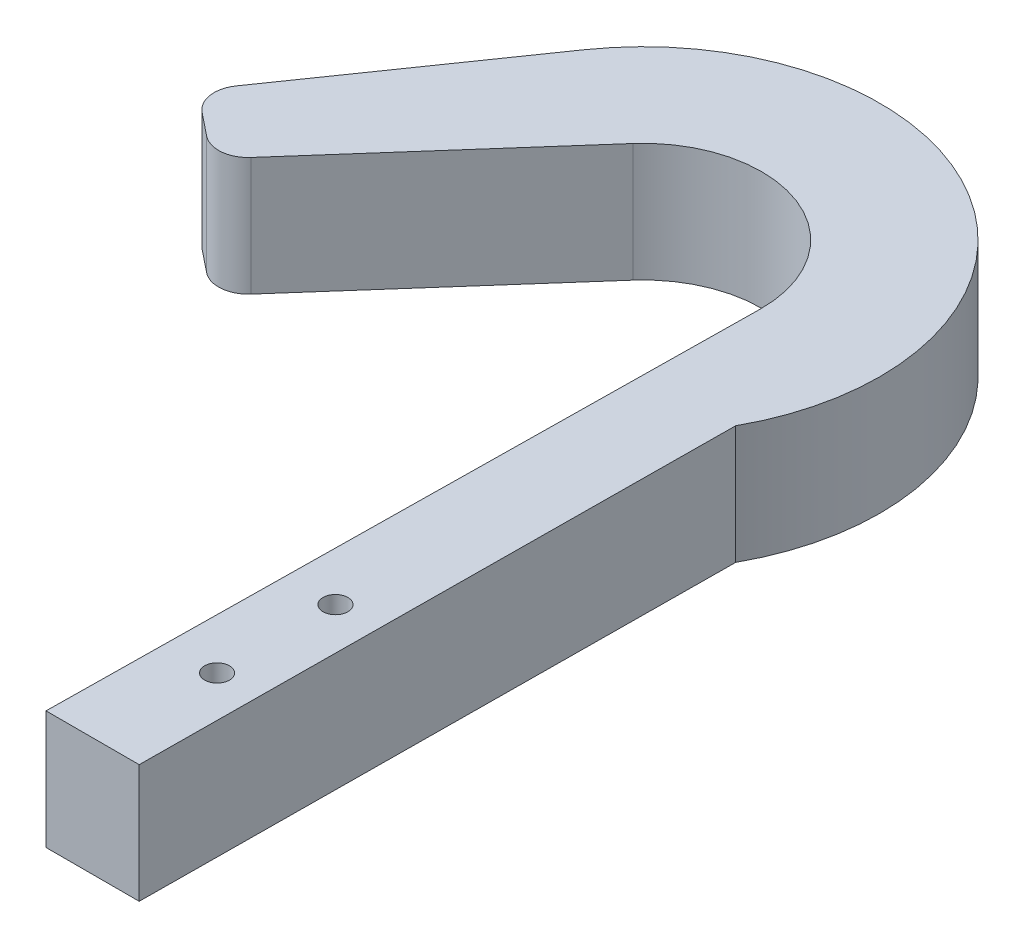
ISO-10303-21;
HEADER;
FILE_DESCRIPTION(('STEP AP214'),'2;1');
FILE_NAME('part.step','',(''),(''),'','','');
FILE_SCHEMA(('AUTOMOTIVE_DESIGN { 1 0 10303 214 1 1 1 1 }'));
ENDSEC;
DATA;
#1=APPLICATION_CONTEXT('core data for automotive mechanical design processes');
#2=APPLICATION_PROTOCOL_DEFINITION('international standard','automotive_design',2000,#1);
#3=PRODUCT_CONTEXT('',#1,'mechanical');
#4=PRODUCT('Part','Part','',(#3));
#5=PRODUCT_RELATED_PRODUCT_CATEGORY('part','',(#4));
#6=PRODUCT_DEFINITION_FORMATION('','',#4);
#7=PRODUCT_DEFINITION_CONTEXT('part definition',#1,'design');
#8=PRODUCT_DEFINITION('design','',#6,#7);
#9=PRODUCT_DEFINITION_SHAPE('','',#8);
#10=(LENGTH_UNIT() NAMED_UNIT(*) SI_UNIT(.MILLI.,.METRE.));
#11=(NAMED_UNIT(*) PLANE_ANGLE_UNIT() SI_UNIT($,.RADIAN.));
#12=(NAMED_UNIT(*) SI_UNIT($,.STERADIAN.) SOLID_ANGLE_UNIT());
#13=UNCERTAINTY_MEASURE_WITH_UNIT(LENGTH_MEASURE(1.E-05),#10,'distance_accuracy_value','');
#14=(GEOMETRIC_REPRESENTATION_CONTEXT(3) GLOBAL_UNCERTAINTY_ASSIGNED_CONTEXT((#13)) GLOBAL_UNIT_ASSIGNED_CONTEXT((#10,
#11,#12)) REPRESENTATION_CONTEXT('',''));
#15=CARTESIAN_POINT('',(0.,0.,0.));
#16=DIRECTION('',(0.,0.,1.));
#17=DIRECTION('',(1.,0.,0.));
#18=AXIS2_PLACEMENT_3D('',#15,#16,#17);
#19=CARTESIAN_POINT('',(-159.444359511071,25.4,-83.1976796572985));
#20=DIRECTION('',(0.,-1.,0.));
#21=DIRECTION('',(0.,0.,-1.));
#22=AXIS2_PLACEMENT_3D('',#19,#20,#21);
#23=CYLINDRICAL_SURFACE('',#22,6.35000000000001);
#24=CARTESIAN_POINT('',(-159.444359511071,0.,-83.1976796572985));
#25=DIRECTION('',(0.,1.,0.));
#26=DIRECTION('',(0.,0.,-1.));
#27=AXIS2_PLACEMENT_3D('',#24,#25,#26);
#28=CIRCLE('',#27,6.35000000000001);
#29=CARTESIAN_POINT('',(-163.411771611835,0.,-78.2396416156222));
#30=VERTEX_POINT('',#29);
#31=CARTESIAN_POINT('',(-154.679488647872,0.,-79.0002392876154));
#32=VERTEX_POINT('',#31);
#33=EDGE_CURVE('E153',#30,#32,#28,.T.);
#34=ORIENTED_EDGE('',*,*,#33,.T.);
#35=DIRECTION('',(0.,-1.,0.));
#36=VECTOR('',#35,1.);
#37=CARTESIAN_POINT('',(-154.679488647872,25.4,-79.0002392876154));
#38=LINE('',#37,#36);
#39=CARTESIAN_POINT('',(-154.679488647872,25.4,-79.0002392876154));
#40=VERTEX_POINT('',#39);
#41=EDGE_CURVE('E13',#40,#32,#38,.T.);
#42=ORIENTED_EDGE('',*,*,#41,.F.);
#43=CARTESIAN_POINT('',(-159.444359511071,25.4,-83.1976796572985));
#44=DIRECTION('',(0.,1.,0.));
#45=DIRECTION('',(0.,0.,-1.));
#46=AXIS2_PLACEMENT_3D('',#43,#44,#45);
#47=CIRCLE('',#46,6.35000000000001);
#48=CARTESIAN_POINT('',(-163.411771611835,25.4,-78.2396416156222));
#49=VERTEX_POINT('',#48);
#50=EDGE_CURVE('E172',#49,#40,#47,.T.);
#51=ORIENTED_EDGE('',*,*,#50,.F.);
#52=DIRECTION('',(0.,-1.,0.));
#53=VECTOR('',#52,1.);
#54=CARTESIAN_POINT('',(-163.411771611835,25.4,-78.2396416156222));
#55=LINE('',#54,#53);
#56=EDGE_CURVE('E149',#49,#30,#55,.T.);
#57=ORIENTED_EDGE('',*,*,#56,.T.);
#58=EDGE_LOOP('',(#34,#42,#51,#57));
#59=FACE_BOUND('',#58,.T.);
#60=ADVANCED_FACE('F45',(#59),#23,.T.);
#61=CARTESIAN_POINT('',(-116.297746729286,25.4,-122.57061257215));
#62=DIRECTION('',(-0.750373364283177,0.,-0.661014231446152));
#63=DIRECTION('',(-0.661014231446152,0.,0.750373364283177));
#64=AXIS2_PLACEMENT_3D('',#61,#62,#63);
#65=PLANE('',#64);
#66=DIRECTION('',(0.661014231446152,0.,-0.750373364283177));
#67=VECTOR('',#66,1.);
#68=CARTESIAN_POINT('',(-116.297746729286,0.,-122.57061257215));
#69=LINE('',#68,#67);
#70=CARTESIAN_POINT('',(-116.297746729286,0.,-122.57061257215));
#71=VERTEX_POINT('',#70);
#72=EDGE_CURVE('E156',#32,#71,#69,.T.);
#73=ORIENTED_EDGE('',*,*,#72,.T.);
#74=DIRECTION('',(0.,-1.,0.));
#75=VECTOR('',#74,1.);
#76=CARTESIAN_POINT('',(-116.297746729286,25.4,-122.57061257215));
#77=LINE('',#76,#75);
#78=CARTESIAN_POINT('',(-116.297746729286,25.4,-122.57061257215));
#79=VERTEX_POINT('',#78);
#80=EDGE_CURVE('E53',#79,#71,#77,.T.);
#81=ORIENTED_EDGE('',*,*,#80,.F.);
#82=DIRECTION('',(0.661014231446152,0.,-0.750373364283177));
#83=VECTOR('',#82,1.);
#84=CARTESIAN_POINT('',(-116.297746729286,25.4,-122.57061257215));
#85=LINE('',#84,#83);
#86=EDGE_CURVE('E110',#40,#79,#85,.T.);
#87=ORIENTED_EDGE('',*,*,#86,.F.);
#88=ORIENTED_EDGE('',*,*,#41,.T.);
#89=EDGE_LOOP('',(#73,#81,#87,#88));
#90=FACE_BOUND('',#89,.T.);
#91=ADVANCED_FACE('F253',(#90),#65,.F.);
#92=CARTESIAN_POINT('',(-97.2382632764932,25.4,-105.780851093417));
#93=DIRECTION('',(0.,-1.,0.));
#94=DIRECTION('',(0.,0.,-1.));
#95=AXIS2_PLACEMENT_3D('',#92,#93,#94);
#96=CYLINDRICAL_SURFACE('',#95,25.4);
#97=CARTESIAN_POINT('',(-97.2382632764932,0.,-105.780851093417));
#98=DIRECTION('',(0.,-1.,0.));
#99=DIRECTION('',(0.,0.,1.));
#100=AXIS2_PLACEMENT_3D('',#97,#98,#99);
#101=CIRCLE('',#100,25.4);
#102=CARTESIAN_POINT('',(-71.8404305336808,0.,-105.449049996177));
#103=VERTEX_POINT('',#102);
#104=EDGE_CURVE('E159',#71,#103,#101,.T.);
#105=ORIENTED_EDGE('',*,*,#104,.T.);
#106=DIRECTION('',(0.,-1.,0.));
#107=VECTOR('',#106,1.);
#108=CARTESIAN_POINT('',(-71.8404305336808,25.4,-105.449049996177));
#109=LINE('',#108,#107);
#110=CARTESIAN_POINT('',(-71.8404305336808,25.4,-105.449049996177));
#111=VERTEX_POINT('',#110);
#112=EDGE_CURVE('E185',#111,#103,#109,.T.);
#113=ORIENTED_EDGE('',*,*,#112,.F.);
#114=CARTESIAN_POINT('',(-97.2382632764932,25.4,-105.780851093417));
#115=DIRECTION('',(0.,-1.,0.));
#116=DIRECTION('',(0.,0.,1.));
#117=AXIS2_PLACEMENT_3D('',#114,#115,#116);
#118=CIRCLE('',#117,25.4);
#119=EDGE_CURVE('E193',#79,#111,#118,.T.);
#120=ORIENTED_EDGE('',*,*,#119,.F.);
#121=ORIENTED_EDGE('',*,*,#80,.T.);
#122=EDGE_LOOP('',(#105,#113,#120,#121));
#123=FACE_BOUND('',#122,.T.);
#124=ADVANCED_FACE('F191',(#123),#96,.F.);
#125=CARTESIAN_POINT('',(-71.8404305336808,25.4,-105.449049996177));
#126=DIRECTION('',(0.999914674913871,0.,0.0130630353244421));
#127=DIRECTION('',(0.0130630353244421,0.,-0.999914674913871));
#128=AXIS2_PLACEMENT_3D('',#125,#126,#127);
#129=PLANE('',#128);
#130=DIRECTION('',(-0.0130630353244421,0.,0.999914674913871));
#131=VECTOR('',#130,1.);
#132=CARTESIAN_POINT('',(-71.8404305336808,0.,-105.449049996177));
#133=LINE('',#132,#131);
#134=CARTESIAN_POINT('',(-73.8167409904888,0.,45.8283353026622));
#135=VERTEX_POINT('',#134);
#136=EDGE_CURVE('E161',#103,#135,#133,.T.);
#137=ORIENTED_EDGE('',*,*,#136,.T.);
#138=DIRECTION('',(0.,-1.,0.));
#139=VECTOR('',#138,1.);
#140=CARTESIAN_POINT('',(-73.8167409904888,25.4,45.8283353026622));
#141=LINE('',#140,#139);
#142=CARTESIAN_POINT('',(-73.8167409904888,25.4,45.8283353026622));
#143=VERTEX_POINT('',#142);
#144=EDGE_CURVE('E182',#143,#135,#141,.T.);
#145=ORIENTED_EDGE('',*,*,#144,.F.);
#146=DIRECTION('',(-0.0130630353244421,0.,0.999914674913871));
#147=VECTOR('',#146,1.);
#148=CARTESIAN_POINT('',(-71.8404305336808,25.4,-105.449049996177));
#149=LINE('',#148,#147);
#150=EDGE_CURVE('E211',#111,#143,#149,.T.);
#151=ORIENTED_EDGE('',*,*,#150,.F.);
#152=ORIENTED_EDGE('',*,*,#112,.T.);
#153=EDGE_LOOP('',(#137,#145,#151,#152));
#154=FACE_BOUND('',#153,.T.);
#155=ADVANCED_FACE('F202',(#154),#129,.F.);
#156=CARTESIAN_POINT('',(-73.8167409904888,25.4,45.8283353026622));
#157=DIRECTION('',(0.,0.,-1.));
#158=DIRECTION('',(-1.,0.,0.));
#159=AXIS2_PLACEMENT_3D('',#156,#157,#158);
#160=PLANE('',#159);
#161=DIRECTION('',(1.,0.,0.));
#162=VECTOR('',#161,1.);
#163=CARTESIAN_POINT('',(-73.8167409904888,0.,45.8283353026622));
#164=LINE('',#163,#162);
#165=CARTESIAN_POINT('',(-53.8167409904887,0.,45.8283353026622));
#166=VERTEX_POINT('',#165);
#167=EDGE_CURVE('E163',#135,#166,#164,.T.);
#168=ORIENTED_EDGE('',*,*,#167,.T.);
#169=DIRECTION('',(0.,-1.,0.));
#170=VECTOR('',#169,1.);
#171=CARTESIAN_POINT('',(-53.8167409904887,25.4,45.8283353026622));
#172=LINE('',#171,#170);
#173=CARTESIAN_POINT('',(-53.8167409904887,25.4,45.8283353026622));
#174=VERTEX_POINT('',#173);
#175=EDGE_CURVE('E179',#174,#166,#172,.T.);
#176=ORIENTED_EDGE('',*,*,#175,.F.);
#177=DIRECTION('',(1.,0.,0.));
#178=VECTOR('',#177,1.);
#179=CARTESIAN_POINT('',(-73.8167409904888,25.4,45.8283353026622));
#180=LINE('',#179,#178);
#181=EDGE_CURVE('E208',#143,#174,#180,.T.);
#182=ORIENTED_EDGE('',*,*,#181,.F.);
#183=ORIENTED_EDGE('',*,*,#144,.T.);
#184=EDGE_LOOP('',(#168,#176,#182,#183));
#185=FACE_BOUND('',#184,.T.);
#186=ADVANCED_FACE('F206',(#185),#160,.F.);
#187=CARTESIAN_POINT('',(-53.8167409904887,25.4,45.8283353026622));
#188=DIRECTION('',(-0.999967764004321,0.,-0.00802938056137474));
#189=DIRECTION('',(-0.00802938056137474,0.,0.999967764004321));
#190=AXIS2_PLACEMENT_3D('',#187,#188,#189);
#191=PLANE('',#190);
#192=DIRECTION('',(0.00802938056137474,0.,-0.999967764004321));
#193=VECTOR('',#192,1.);
#194=CARTESIAN_POINT('',(-53.8167409904887,0.,45.8283353026622));
#195=LINE('',#194,#193);
#196=CARTESIAN_POINT('',(-52.7969767860797,0.,-81.1716646973378));
#197=VERTEX_POINT('',#196);
#198=EDGE_CURVE('E165',#166,#197,#195,.T.);
#199=ORIENTED_EDGE('',*,*,#198,.T.);
#200=DIRECTION('',(0.,-1.,0.));
#201=VECTOR('',#200,1.);
#202=CARTESIAN_POINT('',(-52.7969767860797,25.4,-81.1716646973378));
#203=LINE('',#202,#201);
#204=CARTESIAN_POINT('',(-52.7969767860797,25.4,-81.1716646973378));
#205=VERTEX_POINT('',#204);
#206=EDGE_CURVE('E176',#205,#197,#203,.T.);
#207=ORIENTED_EDGE('',*,*,#206,.F.);
#208=DIRECTION('',(0.00802938056137474,0.,-0.999967764004321));
#209=VECTOR('',#208,1.);
#210=CARTESIAN_POINT('',(-53.8167409904887,25.4,45.8283353026622));
#211=LINE('',#210,#209);
#212=EDGE_CURVE('E210',#174,#205,#211,.T.);
#213=ORIENTED_EDGE('',*,*,#212,.F.);
#214=ORIENTED_EDGE('',*,*,#175,.T.);
#215=EDGE_LOOP('',(#199,#207,#213,#214));
#216=FACE_BOUND('',#215,.T.);
#217=ADVANCED_FACE('F265',(#216),#191,.F.);
#218=CARTESIAN_POINT('',(-97.2382632764932,25.4,-105.780851093417));
#219=DIRECTION('',(0.,-1.,0.));
#220=DIRECTION('',(0.,0.,-1.));
#221=AXIS2_PLACEMENT_3D('',#218,#219,#220);
#222=CYLINDRICAL_SURFACE('',#221,50.8);
#223=CARTESIAN_POINT('',(-97.2382632764932,0.,-105.780851093417));
#224=DIRECTION('',(0.,1.,0.));
#225=DIRECTION('',(0.,0.,1.));
#226=AXIS2_PLACEMENT_3D('',#223,#224,#225);
#227=CIRCLE('',#226,50.8);
#228=CARTESIAN_POINT('',(-138.959581608563,0.,-134.763114577039));
#229=VERTEX_POINT('',#228);
#230=EDGE_CURVE('E167',#197,#229,#227,.T.);
#231=ORIENTED_EDGE('',*,*,#230,.T.);
#232=DIRECTION('',(0.,-1.,0.));
#233=VECTOR('',#232,1.);
#234=CARTESIAN_POINT('',(-138.959581608563,25.4,-134.763114577039));
#235=LINE('',#234,#233);
#236=CARTESIAN_POINT('',(-138.959581608563,25.4,-134.763114577039));
#237=VERTEX_POINT('',#236);
#238=EDGE_CURVE('E144',#237,#229,#235,.T.);
#239=ORIENTED_EDGE('',*,*,#238,.F.);
#240=CARTESIAN_POINT('',(-97.2382632764932,25.4,-105.780851093417));
#241=DIRECTION('',(0.,1.,0.));
#242=DIRECTION('',(0.,0.,1.));
#243=AXIS2_PLACEMENT_3D('',#240,#241,#242);
#244=CIRCLE('',#243,50.8);
#245=EDGE_CURVE('E135',#205,#237,#244,.T.);
#246=ORIENTED_EDGE('',*,*,#245,.F.);
#247=ORIENTED_EDGE('',*,*,#206,.T.);
#248=EDGE_LOOP('',(#231,#239,#246,#247));
#249=FACE_BOUND('',#248,.T.);
#250=ADVANCED_FACE('F262',(#249),#222,.T.);
#251=CARTESIAN_POINT('',(-138.959581608563,25.4,-134.763114577039));
#252=DIRECTION('',(0.821285793938387,0.,0.57051699770909));
#253=DIRECTION('',(0.57051699770909,0.,-0.821285793938387));
#254=AXIS2_PLACEMENT_3D('',#251,#252,#253);
#255=PLANE('',#254);
#256=DIRECTION('',(-0.57051699770909,0.,0.821285793938387));
#257=VECTOR('',#256,1.);
#258=CARTESIAN_POINT('',(-138.959581608563,0.,-134.763114577039));
#259=LINE('',#258,#257);
#260=CARTESIAN_POINT('',(-169.546861652518,0.,-90.7313001417323));
#261=VERTEX_POINT('',#260);
#262=EDGE_CURVE('E143',#229,#261,#259,.T.);
#263=ORIENTED_EDGE('',*,*,#262,.T.);
#264=DIRECTION('',(0.,-1.,0.));
#265=VECTOR('',#264,1.);
#266=CARTESIAN_POINT('',(-169.546861652518,25.4,-90.7313001417323));
#267=LINE('',#266,#265);
#268=CARTESIAN_POINT('',(-169.546861652518,25.4,-90.7313001417323));
#269=VERTEX_POINT('',#268);
#270=EDGE_CURVE('E140',#269,#261,#267,.T.);
#271=ORIENTED_EDGE('',*,*,#270,.F.);
#272=DIRECTION('',(-0.57051699770909,0.,0.821285793938387));
#273=VECTOR('',#272,1.);
#274=CARTESIAN_POINT('',(-138.959581608563,25.4,-134.763114577039));
#275=LINE('',#274,#273);
#276=EDGE_CURVE('E129',#237,#269,#275,.T.);
#277=ORIENTED_EDGE('',*,*,#276,.F.);
#278=ORIENTED_EDGE('',*,*,#238,.T.);
#279=EDGE_LOOP('',(#263,#271,#277,#278));
#280=FACE_BOUND('',#279,.T.);
#281=ADVANCED_FACE('F141',(#280),#255,.F.);
#282=CARTESIAN_POINT('',(-164.331696861009,25.4,-87.1085172062795));
#283=DIRECTION('',(0.,-1.,0.));
#284=DIRECTION('',(0.,0.,-1.));
#285=AXIS2_PLACEMENT_3D('',#282,#283,#284);
#286=CYLINDRICAL_SURFACE('',#285,6.34999999999999);
#287=CARTESIAN_POINT('',(-164.331696861009,0.,-87.1085172062795));
#288=DIRECTION('',(0.,1.,0.));
#289=DIRECTION('',(0.,0.,1.));
#290=AXIS2_PLACEMENT_3D('',#287,#288,#289);
#291=CIRCLE('',#290,6.34999999999999);
#292=CARTESIAN_POINT('',(-168.299108961773,0.,-82.1504791646033));
#293=VERTEX_POINT('',#292);
#294=EDGE_CURVE('E96',#261,#293,#291,.T.);
#295=ORIENTED_EDGE('',*,*,#294,.T.);
#296=DIRECTION('',(0.,-1.,0.));
#297=VECTOR('',#296,1.);
#298=CARTESIAN_POINT('',(-168.299108961773,25.4,-82.1504791646033));
#299=LINE('',#298,#297);
#300=CARTESIAN_POINT('',(-168.299108961773,25.4,-82.1504791646033));
#301=VERTEX_POINT('',#300);
#302=EDGE_CURVE('E145',#301,#293,#299,.T.);
#303=ORIENTED_EDGE('',*,*,#302,.F.);
#304=CARTESIAN_POINT('',(-164.331696861009,25.4,-87.1085172062795));
#305=DIRECTION('',(0.,1.,0.));
#306=DIRECTION('',(0.,0.,1.));
#307=AXIS2_PLACEMENT_3D('',#304,#305,#306);
#308=CIRCLE('',#307,6.34999999999999);
#309=EDGE_CURVE('E133',#269,#301,#308,.T.);
#310=ORIENTED_EDGE('',*,*,#309,.F.);
#311=ORIENTED_EDGE('',*,*,#270,.T.);
#312=EDGE_LOOP('',(#295,#303,#310,#311));
#313=FACE_BOUND('',#312,.T.);
#314=ADVANCED_FACE('F147',(#313),#286,.T.);
#315=CARTESIAN_POINT('',(-168.299108961773,25.4,-82.1504791646033));
#316=DIRECTION('',(0.624789307206975,0.,-0.780793392389964));
#317=DIRECTION('',(-0.780793392389964,0.,-0.624789307206975));
#318=AXIS2_PLACEMENT_3D('',#315,#316,#317);
#319=PLANE('',#318);
#320=DIRECTION('',(0.780793392389964,0.,0.624789307206975));
#321=VECTOR('',#320,1.);
#322=CARTESIAN_POINT('',(-168.299108961773,0.,-82.1504791646033));
#323=LINE('',#322,#321);
#324=EDGE_CURVE('E102',#293,#30,#323,.T.);
#325=ORIENTED_EDGE('',*,*,#324,.T.);
#326=ORIENTED_EDGE('',*,*,#56,.F.);
#327=DIRECTION('',(0.780793392389964,0.,0.624789307206975));
#328=VECTOR('',#327,1.);
#329=CARTESIAN_POINT('',(-168.299108961773,25.4,-82.1504791646033));
#330=LINE('',#329,#328);
#331=EDGE_CURVE('E61',#301,#49,#330,.T.);
#332=ORIENTED_EDGE('',*,*,#331,.F.);
#333=ORIENTED_EDGE('',*,*,#302,.T.);
#334=EDGE_LOOP('',(#325,#326,#332,#333));
#335=FACE_BOUND('',#334,.T.);
#336=ADVANCED_FACE('F317',(#335),#319,.F.);
#337=CARTESIAN_POINT('',(-159.444359511071,25.4,-83.1976796572985));
#338=DIRECTION('',(0.,-1.,0.));
#339=DIRECTION('',(0.,0.,-1.));
#340=AXIS2_PLACEMENT_3D('',#337,#338,#339);
#341=PLANE('',#340);
#342=CARTESIAN_POINT('',(-62.5030747368469,25.4,-4.97166469733783));
#343=DIRECTION('',(0.,-1.,0.));
#344=DIRECTION('',(0.,0.,-1.));
#345=AXIS2_PLACEMENT_3D('',#342,#343,#344);
#346=CIRCLE('',#345,2.667);
#347=CARTESIAN_POINT('',(-62.5030747368469,25.4,-7.63866469733782));
#348=VERTEX_POINT('',#347);
#349=EDGE_CURVE('E157',#348,#348,#346,.T.);
#350=ORIENTED_EDGE('',*,*,#349,.T.);
#351=EDGE_LOOP('',(#350));
#352=FACE_BOUND('',#351,.T.);
#353=CARTESIAN_POINT('',(-62.5030747368469,25.4,20.4283353026622));
#354=DIRECTION('',(0.,-1.,0.));
#355=DIRECTION('',(0.,0.,-1.));
#356=AXIS2_PLACEMENT_3D('',#353,#354,#355);
#357=CIRCLE('',#356,2.667);
#358=CARTESIAN_POINT('',(-62.5030747368469,25.4,17.7613353026622));
#359=VERTEX_POINT('',#358);
#360=EDGE_CURVE('E222',#359,#359,#357,.T.);
#361=ORIENTED_EDGE('',*,*,#360,.T.);
#362=EDGE_LOOP('',(#361));
#363=FACE_BOUND('',#362,.T.);
#364=ORIENTED_EDGE('',*,*,#50,.T.);
#365=ORIENTED_EDGE('',*,*,#86,.T.);
#366=ORIENTED_EDGE('',*,*,#119,.T.);
#367=ORIENTED_EDGE('',*,*,#150,.T.);
#368=ORIENTED_EDGE('',*,*,#181,.T.);
#369=ORIENTED_EDGE('',*,*,#212,.T.);
#370=ORIENTED_EDGE('',*,*,#245,.T.);
#371=ORIENTED_EDGE('',*,*,#276,.T.);
#372=ORIENTED_EDGE('',*,*,#309,.T.);
#373=ORIENTED_EDGE('',*,*,#331,.T.);
#374=EDGE_LOOP('',(#364,#365,#366,#367,#368,#369,#370,#371,#372,#373));
#375=FACE_BOUND('',#374,.T.);
#376=ADVANCED_FACE('F131',(#352,#363,#375),#341,.F.);
#377=CARTESIAN_POINT('',(-159.444359511071,0.,-83.1976796572985));
#378=DIRECTION('',(0.,-1.,0.));
#379=DIRECTION('',(0.,0.,-1.));
#380=AXIS2_PLACEMENT_3D('',#377,#378,#379);
#381=PLANE('',#380);
#382=CARTESIAN_POINT('',(-62.5030747368469,0.,-4.97166469733783));
#383=DIRECTION('',(0.,-1.,0.));
#384=DIRECTION('',(0.,0.,-1.));
#385=AXIS2_PLACEMENT_3D('',#382,#383,#384);
#386=CIRCLE('',#385,2.667);
#387=CARTESIAN_POINT('',(-62.5030747368469,0.,-7.63866469733782));
#388=VERTEX_POINT('',#387);
#389=EDGE_CURVE('E225',#388,#388,#386,.T.);
#390=ORIENTED_EDGE('',*,*,#389,.F.);
#391=EDGE_LOOP('',(#390));
#392=FACE_BOUND('',#391,.T.);
#393=CARTESIAN_POINT('',(-62.5030747368469,0.,20.4283353026622));
#394=DIRECTION('',(0.,-1.,0.));
#395=DIRECTION('',(0.,0.,-1.));
#396=AXIS2_PLACEMENT_3D('',#393,#394,#395);
#397=CIRCLE('',#396,2.667);
#398=CARTESIAN_POINT('',(-62.5030747368469,0.,17.7613353026622));
#399=VERTEX_POINT('',#398);
#400=EDGE_CURVE('E219',#399,#399,#397,.T.);
#401=ORIENTED_EDGE('',*,*,#400,.F.);
#402=EDGE_LOOP('',(#401));
#403=FACE_BOUND('',#402,.T.);
#404=ORIENTED_EDGE('',*,*,#33,.F.);
#405=ORIENTED_EDGE('',*,*,#324,.F.);
#406=ORIENTED_EDGE('',*,*,#294,.F.);
#407=ORIENTED_EDGE('',*,*,#262,.F.);
#408=ORIENTED_EDGE('',*,*,#230,.F.);
#409=ORIENTED_EDGE('',*,*,#198,.F.);
#410=ORIENTED_EDGE('',*,*,#167,.F.);
#411=ORIENTED_EDGE('',*,*,#136,.F.);
#412=ORIENTED_EDGE('',*,*,#104,.F.);
#413=ORIENTED_EDGE('',*,*,#72,.F.);
#414=EDGE_LOOP('',(#404,#405,#406,#407,#408,#409,#410,#411,#412,#413));
#415=FACE_BOUND('',#414,.T.);
#416=ADVANCED_FACE('F197',(#392,#403,#415),#381,.T.);
#417=CARTESIAN_POINT('',(-62.5030747368469,25.4,20.4283353026622));
#418=DIRECTION('',(0.,-1.,0.));
#419=DIRECTION('',(0.,0.,-1.));
#420=AXIS2_PLACEMENT_3D('',#417,#418,#419);
#421=CYLINDRICAL_SURFACE('',#420,2.667);
#422=ORIENTED_EDGE('',*,*,#360,.F.);
#423=EDGE_LOOP('',(#422));
#424=FACE_BOUND('',#423,.T.);
#425=ORIENTED_EDGE('',*,*,#400,.T.);
#426=EDGE_LOOP('',(#425));
#427=FACE_BOUND('',#426,.T.);
#428=ADVANCED_FACE('F236',(#424,#427),#421,.F.);
#429=CARTESIAN_POINT('',(-62.5030747368469,25.4,-4.97166469733783));
#430=DIRECTION('',(0.,-1.,0.));
#431=DIRECTION('',(0.,0.,-1.));
#432=AXIS2_PLACEMENT_3D('',#429,#430,#431);
#433=CYLINDRICAL_SURFACE('',#432,2.667);
#434=ORIENTED_EDGE('',*,*,#349,.F.);
#435=EDGE_LOOP('',(#434));
#436=FACE_BOUND('',#435,.T.);
#437=ORIENTED_EDGE('',*,*,#389,.T.);
#438=EDGE_LOOP('',(#437));
#439=FACE_BOUND('',#438,.T.);
#440=ADVANCED_FACE('F233',(#436,#439),#433,.F.);
#441=CLOSED_SHELL('',(#60,#91,#124,#155,#186,#217,#250,#281,#314,#336,#376,#416,#428,#440));
#442=MANIFOLD_SOLID_BREP('B2',#441);
#443=ADVANCED_BREP_SHAPE_REPRESENTATION('',(#18,#442),#14);
#444=SHAPE_DEFINITION_REPRESENTATION(#9,#443);
ENDSEC;
END-ISO-10303-21;
